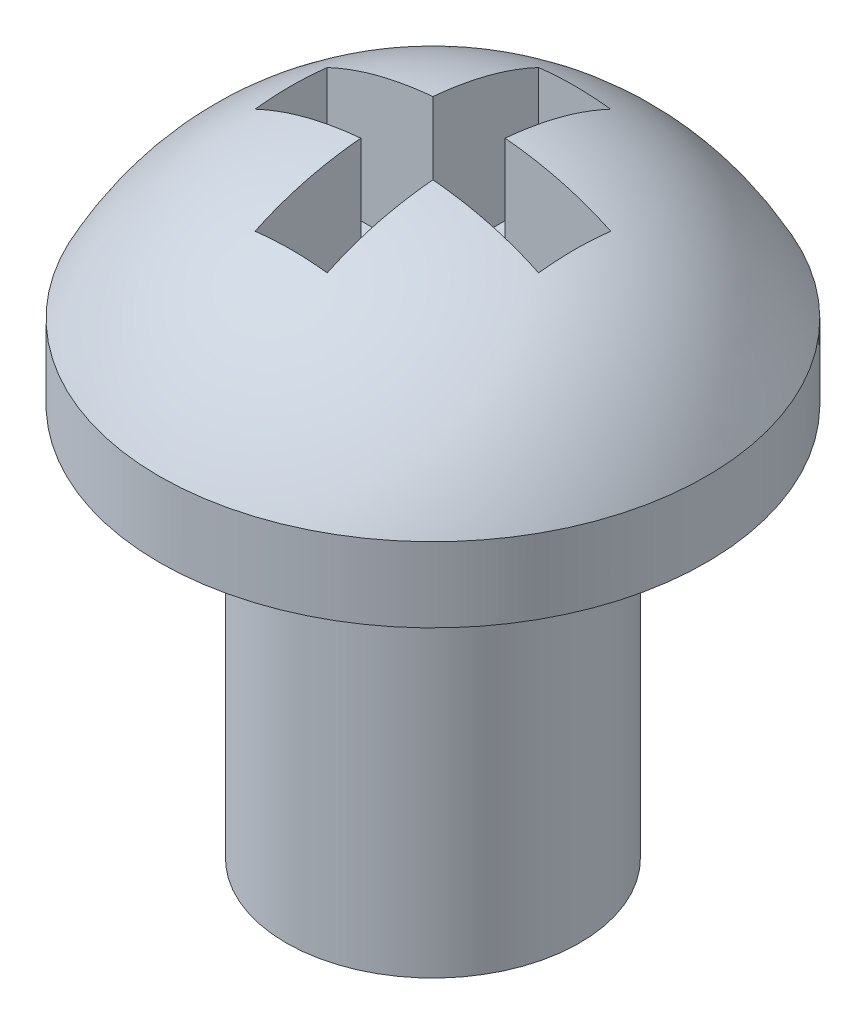
ISO-10303-21;
HEADER;
FILE_DESCRIPTION(('STEP AP214'),'2;1');
FILE_NAME('part.step','',(''),(''),'','','');
FILE_SCHEMA(('AUTOMOTIVE_DESIGN { 1 0 10303 214 1 1 1 1 }'));
ENDSEC;
DATA;
#1=APPLICATION_CONTEXT('core data for automotive mechanical design processes');
#2=APPLICATION_PROTOCOL_DEFINITION('international standard','automotive_design',2000,#1);
#3=PRODUCT_CONTEXT('',#1,'mechanical');
#4=PRODUCT('Part','Part','',(#3));
#5=PRODUCT_RELATED_PRODUCT_CATEGORY('part','',(#4));
#6=PRODUCT_DEFINITION_FORMATION('','',#4);
#7=PRODUCT_DEFINITION_CONTEXT('part definition',#1,'design');
#8=PRODUCT_DEFINITION('design','',#6,#7);
#9=PRODUCT_DEFINITION_SHAPE('','',#8);
#10=(LENGTH_UNIT() NAMED_UNIT(*) SI_UNIT(.MILLI.,.METRE.));
#11=(NAMED_UNIT(*) PLANE_ANGLE_UNIT() SI_UNIT($,.RADIAN.));
#12=(NAMED_UNIT(*) SI_UNIT($,.STERADIAN.) SOLID_ANGLE_UNIT());
#13=UNCERTAINTY_MEASURE_WITH_UNIT(LENGTH_MEASURE(1.E-05),#10,'distance_accuracy_value','');
#14=(GEOMETRIC_REPRESENTATION_CONTEXT(3) GLOBAL_UNCERTAINTY_ASSIGNED_CONTEXT((#13)) GLOBAL_UNIT_ASSIGNED_CONTEXT((#10,
#11,#12)) REPRESENTATION_CONTEXT('',''));
#15=CARTESIAN_POINT('',(0.,0.,0.));
#16=DIRECTION('',(0.,0.,1.));
#17=DIRECTION('',(1.,0.,0.));
#18=AXIS2_PLACEMENT_3D('',#15,#16,#17);
#19=CARTESIAN_POINT('',(0.,0.889,0.));
#20=DIRECTION('',(0.,1.,0.));
#21=DIRECTION('',(0.,0.,1.));
#22=AXIS2_PLACEMENT_3D('',#19,#20,#21);
#23=PLANE('',#22);
#24=DIRECTION('',(-1.,0.,0.));
#25=VECTOR('',#24,1.);
#26=CARTESIAN_POINT('',(0.3683,0.889,-1.4478));
#27=LINE('',#26,#25);
#28=CARTESIAN_POINT('',(0.3683,0.889,-1.4478));
#29=VERTEX_POINT('',#28);
#30=CARTESIAN_POINT('',(-0.3683,0.889,-1.4478));
#31=VERTEX_POINT('',#30);
#32=EDGE_CURVE('E123',#29,#31,#27,.T.);
#33=ORIENTED_EDGE('',*,*,#32,.T.);
#34=DIRECTION('',(0.,0.,1.));
#35=VECTOR('',#34,1.);
#36=CARTESIAN_POINT('',(-0.3683,0.889,-1.4478));
#37=LINE('',#36,#35);
#38=CARTESIAN_POINT('',(-0.3683,0.889,-0.3683));
#39=VERTEX_POINT('',#38);
#40=EDGE_CURVE('E92',#31,#39,#37,.T.);
#41=ORIENTED_EDGE('',*,*,#40,.T.);
#42=DIRECTION('',(-1.,0.,0.));
#43=VECTOR('',#42,1.);
#44=CARTESIAN_POINT('',(-0.3683,0.889,-0.3683));
#45=LINE('',#44,#43);
#46=CARTESIAN_POINT('',(-1.4478,0.889,-0.3683));
#47=VERTEX_POINT('',#46);
#48=EDGE_CURVE('E238',#39,#47,#45,.T.);
#49=ORIENTED_EDGE('',*,*,#48,.T.);
#50=DIRECTION('',(0.,0.,1.));
#51=VECTOR('',#50,1.);
#52=CARTESIAN_POINT('',(-1.4478,0.889,-0.3683));
#53=LINE('',#52,#51);
#54=CARTESIAN_POINT('',(-1.4478,0.889,0.3683));
#55=VERTEX_POINT('',#54);
#56=EDGE_CURVE('E146',#47,#55,#53,.T.);
#57=ORIENTED_EDGE('',*,*,#56,.T.);
#58=DIRECTION('',(1.,0.,0.));
#59=VECTOR('',#58,1.);
#60=CARTESIAN_POINT('',(-1.4478,0.889,0.3683));
#61=LINE('',#60,#59);
#62=CARTESIAN_POINT('',(-0.3683,0.889,0.3683));
#63=VERTEX_POINT('',#62);
#64=EDGE_CURVE('E152',#55,#63,#61,.T.);
#65=ORIENTED_EDGE('',*,*,#64,.T.);
#66=DIRECTION('',(0.,0.,1.));
#67=VECTOR('',#66,1.);
#68=CARTESIAN_POINT('',(-0.3683,0.889,0.3683));
#69=LINE('',#68,#67);
#70=CARTESIAN_POINT('',(-0.3683,0.889,1.4478));
#71=VERTEX_POINT('',#70);
#72=EDGE_CURVE('E157',#63,#71,#69,.T.);
#73=ORIENTED_EDGE('',*,*,#72,.T.);
#74=DIRECTION('',(1.,0.,0.));
#75=VECTOR('',#74,1.);
#76=CARTESIAN_POINT('',(-0.3683,0.889,1.4478));
#77=LINE('',#76,#75);
#78=CARTESIAN_POINT('',(0.3683,0.889,1.4478));
#79=VERTEX_POINT('',#78);
#80=EDGE_CURVE('E136',#71,#79,#77,.T.);
#81=ORIENTED_EDGE('',*,*,#80,.T.);
#82=DIRECTION('',(0.,0.,-1.));
#83=VECTOR('',#82,1.);
#84=CARTESIAN_POINT('',(0.3683,0.889,1.4478));
#85=LINE('',#84,#83);
#86=CARTESIAN_POINT('',(0.3683,0.889,0.3683));
#87=VERTEX_POINT('',#86);
#88=EDGE_CURVE('E163',#79,#87,#85,.T.);
#89=ORIENTED_EDGE('',*,*,#88,.T.);
#90=DIRECTION('',(1.,0.,0.));
#91=VECTOR('',#90,1.);
#92=CARTESIAN_POINT('',(0.3683,0.889,0.3683));
#93=LINE('',#92,#91);
#94=CARTESIAN_POINT('',(1.4478,0.889,0.3683));
#95=VERTEX_POINT('',#94);
#96=EDGE_CURVE('E170',#87,#95,#93,.T.);
#97=ORIENTED_EDGE('',*,*,#96,.T.);
#98=DIRECTION('',(0.,0.,-1.));
#99=VECTOR('',#98,1.);
#100=CARTESIAN_POINT('',(1.4478,0.889,0.3683));
#101=LINE('',#100,#99);
#102=CARTESIAN_POINT('',(1.4478,0.889,-0.3683));
#103=VERTEX_POINT('',#102);
#104=EDGE_CURVE('E175',#95,#103,#101,.T.);
#105=ORIENTED_EDGE('',*,*,#104,.T.);
#106=DIRECTION('',(-1.,0.,0.));
#107=VECTOR('',#106,1.);
#108=CARTESIAN_POINT('',(1.4478,0.889,-0.3683));
#109=LINE('',#108,#107);
#110=CARTESIAN_POINT('',(0.3683,0.889,-0.3683));
#111=VERTEX_POINT('',#110);
#112=EDGE_CURVE('E126',#103,#111,#109,.T.);
#113=ORIENTED_EDGE('',*,*,#112,.T.);
#114=DIRECTION('',(0.,0.,-1.));
#115=VECTOR('',#114,1.);
#116=CARTESIAN_POINT('',(0.3683,0.889,-0.3683));
#117=LINE('',#116,#115);
#118=EDGE_CURVE('E120',#111,#29,#117,.T.);
#119=ORIENTED_EDGE('',*,*,#118,.T.);
#120=EDGE_LOOP('',(#33,#41,#49,#57,#65,#73,#81,#89,#97,#105,#113,#119));
#121=FACE_BOUND('',#120,.T.);
#122=ADVANCED_FACE('F17',(#121),#23,.T.);
#123=CARTESIAN_POINT('',(0.3683,2.921,-0.3683));
#124=DIRECTION('',(1.,0.,0.));
#125=DIRECTION('',(0.,0.,-1.));
#126=AXIS2_PLACEMENT_3D('',#123,#124,#125);
#127=PLANE('',#126);
#128=DIRECTION('',(0.,1.,0.));
#129=VECTOR('',#128,1.);
#130=CARTESIAN_POINT('',(0.3683,2.921,-1.4478));
#131=LINE('',#130,#129);
#132=CARTESIAN_POINT('',(0.368299999999467,2.07264834657823,-1.44779999999055));
#133=VERTEX_POINT('',#132);
#134=EDGE_CURVE('E128',#133,#29,#131,.F.);
#135=ORIENTED_EDGE('',*,*,#134,.T.);
#136=ORIENTED_EDGE('',*,*,#118,.F.);
#137=DIRECTION('',(0.,1.,0.));
#138=VECTOR('',#137,1.);
#139=CARTESIAN_POINT('',(0.3683,2.921,-0.3683));
#140=LINE('',#139,#138);
#141=CARTESIAN_POINT('',(0.368300010789898,2.35562858009134,-0.3683));
#142=VERTEX_POINT('',#141);
#143=EDGE_CURVE('E76',#111,#142,#140,.T.);
#144=ORIENTED_EDGE('',*,*,#143,.T.);
#145=CARTESIAN_POINT('',(0.3683,2.0726118187436,-1.44787696444893));
#146=CARTESIAN_POINT('',(0.3683,2.09280651130751,-1.40533658499151));
#147=CARTESIAN_POINT('',(0.3683,2.11190026710847,-1.36227810781092));
#148=CARTESIAN_POINT('',(0.3683,2.14779770116496,-1.27553185377699));
#149=CARTESIAN_POINT('',(0.3683,2.16461496615479,-1.23184970317808));
#150=CARTESIAN_POINT('',(0.3683,2.1960628143741,-1.14389631537386));
#151=CARTESIAN_POINT('',(0.3683,2.2107015501155,-1.09962798601404));
#152=CARTESIAN_POINT('',(0.3683,2.2378948009813,-1.01053874093526));
#153=CARTESIAN_POINT('',(0.3683,2.25045279291184,-0.965718884239403));
#154=CARTESIAN_POINT('',(0.3683,2.27356879660532,-0.875599318412506));
#155=CARTESIAN_POINT('',(0.3683,2.28412812064981,-0.830299944900254));
#156=CARTESIAN_POINT('',(0.3683,2.30335185902914,-0.739197079137124));
#157=CARTESIAN_POINT('',(0.3683,2.31201201476126,-0.693392691017519));
#158=CARTESIAN_POINT('',(0.3683,2.32751957396641,-0.601294070177135));
#159=CARTESIAN_POINT('',(0.3683,2.33435969292916,-0.554998617981862));
#160=CARTESIAN_POINT('',(0.3683,2.34630000052672,-0.461927306969817));
#161=CARTESIAN_POINT('',(0.3683,2.35139052490193,-0.415150204746829));
#162=CARTESIAN_POINT('',(0.368300000000001,2.35562869938095,-0.368300021579796));
#163=B_SPLINE_CURVE_WITH_KNOTS('',3,(#145,#146,#147,#148,#149,#150,#151,#152,#153,#154,#155,
#156,#157,#158,#159,#160,#161,#162),.UNSPECIFIED.,.F.,.F.,(4,2,2,2,2,2,2,2,4),(0.,
0.141249649925463,0.281615139896473,0.421441378426826,0.561031566041087,0.7005297814342,
0.840337672994682,0.980696989582692,1.12181959897531),.UNSPECIFIED.);
#164=EDGE_CURVE('E20',#133,#142,#163,.T.);
#165=ORIENTED_EDGE('',*,*,#164,.F.);
#166=EDGE_LOOP('',(#135,#136,#144,#165));
#167=FACE_BOUND('',#166,.T.);
#168=ADVANCED_FACE('F129',(#167),#127,.F.);
#169=CARTESIAN_POINT('',(1.4478,2.921,-0.3683));
#170=DIRECTION('',(0.,0.,-1.));
#171=DIRECTION('',(-1.,0.,0.));
#172=AXIS2_PLACEMENT_3D('',#169,#170,#171);
#173=PLANE('',#172);
#174=ORIENTED_EDGE('',*,*,#143,.F.);
#175=ORIENTED_EDGE('',*,*,#112,.F.);
#176=DIRECTION('',(0.,1.,0.));
#177=VECTOR('',#176,1.);
#178=CARTESIAN_POINT('',(1.4478,2.921,-0.3683));
#179=LINE('',#178,#177);
#180=CARTESIAN_POINT('',(1.44779999999997,2.07264834657369,-0.368300000000003));
#181=VERTEX_POINT('',#180);
#182=EDGE_CURVE('E172',#103,#181,#179,.T.);
#183=ORIENTED_EDGE('',*,*,#182,.T.);
#184=CARTESIAN_POINT('',(0.368300021579796,2.35562869938095,-0.3683));
#185=CARTESIAN_POINT('',(0.415150204746828,2.35139052490193,-0.3683));
#186=CARTESIAN_POINT('',(0.461927306969816,2.34630000052672,-0.3683));
#187=CARTESIAN_POINT('',(0.554998617981861,2.33435969292916,-0.3683));
#188=CARTESIAN_POINT('',(0.601294070177134,2.32751957396641,-0.3683));
#189=CARTESIAN_POINT('',(0.693392691017519,2.31201201476126,-0.3683));
#190=CARTESIAN_POINT('',(0.739197079137124,2.30335185902914,-0.3683));
#191=CARTESIAN_POINT('',(0.830299944900253,2.28412812064981,-0.3683));
#192=CARTESIAN_POINT('',(0.875599318412505,2.27356879660532,-0.3683));
#193=CARTESIAN_POINT('',(0.965718884239402,2.25045279291185,-0.3683));
#194=CARTESIAN_POINT('',(1.01053874093526,2.2378948009813,-0.3683));
#195=CARTESIAN_POINT('',(1.09962798601404,2.2107015501155,-0.3683));
#196=CARTESIAN_POINT('',(1.14389631537386,2.1960628143741,-0.3683));
#197=CARTESIAN_POINT('',(1.23184970317808,2.16461496615479,-0.3683));
#198=CARTESIAN_POINT('',(1.27553185377699,2.14779770116496,-0.3683));
#199=CARTESIAN_POINT('',(1.36227810781092,2.11190026710847,-0.3683));
#200=CARTESIAN_POINT('',(1.40533658499151,2.09280651130751,-0.3683));
#201=CARTESIAN_POINT('',(1.44787696444893,2.0726118187436,-0.3683));
#202=B_SPLINE_CURVE_WITH_KNOTS('',3,(#184,#185,#186,#187,#188,#189,#190,#191,#192,#193,#194,
#195,#196,#197,#198,#199,#200,#201),.UNSPECIFIED.,.F.,.F.,(4,2,2,2,2,2,2,2,4),(0.,
0.141122609392623,0.281481925980632,0.421289817541115,0.560788032934228,0.700378220548488,
0.840204459078841,0.980569949049852,1.12181959897531),.UNSPECIFIED.);
#203=EDGE_CURVE('E361',#142,#181,#202,.T.);
#204=ORIENTED_EDGE('',*,*,#203,.F.);
#205=EDGE_LOOP('',(#174,#175,#183,#204));
#206=FACE_BOUND('',#205,.T.);
#207=ADVANCED_FACE('F366',(#206),#173,.F.);
#208=CARTESIAN_POINT('',(1.4478,2.921,0.3683));
#209=DIRECTION('',(1.,0.,0.));
#210=DIRECTION('',(0.,0.,-1.));
#211=AXIS2_PLACEMENT_3D('',#208,#209,#210);
#212=PLANE('',#211);
#213=ORIENTED_EDGE('',*,*,#182,.F.);
#214=ORIENTED_EDGE('',*,*,#104,.F.);
#215=DIRECTION('',(0.,1.,0.));
#216=VECTOR('',#215,1.);
#217=CARTESIAN_POINT('',(1.4478,2.921,0.3683));
#218=LINE('',#217,#216);
#219=CARTESIAN_POINT('',(1.44779999999052,2.07264834657824,0.36829999999947));
#220=VERTEX_POINT('',#219);
#221=EDGE_CURVE('E165',#95,#220,#218,.T.);
#222=ORIENTED_EDGE('',*,*,#221,.T.);
#223=CARTESIAN_POINT('',(1.4478,2.07264549196157,-0.368323644123604));
#224=CARTESIAN_POINT('',(1.4478,2.0775746608626,-0.327488076242911));
#225=CARTESIAN_POINT('',(1.4478,2.08167142491566,-0.286552891921881));
#226=CARTESIAN_POINT('',(1.4478,2.08820240910207,-0.20468079222152));
#227=CARTESIAN_POINT('',(1.4478,2.09064186602772,-0.163744294912723));
#228=CARTESIAN_POINT('',(1.4478,2.09388904960136,-0.0818717971872853));
#229=CARTESIAN_POINT('',(1.4478,2.09469935350827,-0.0409358985936425));
#230=CARTESIAN_POINT('',(1.4478,2.09469935350827,0.040935898593643));
#231=CARTESIAN_POINT('',(1.4478,2.09388904960136,0.0818717971872858));
#232=CARTESIAN_POINT('',(1.4478,2.09064186602772,0.163744294912724));
#233=CARTESIAN_POINT('',(1.4478,2.08820240910207,0.20468079222152));
#234=CARTESIAN_POINT('',(1.4478,2.08167142491566,0.286552891921882));
#235=CARTESIAN_POINT('',(1.4478,2.0775746608626,0.327488076242912));
#236=CARTESIAN_POINT('',(1.4478,2.07264549196157,0.368323644123605));
#237=B_SPLINE_CURVE_WITH_KNOTS('',3,(#223,#224,#225,#226,#227,#228,#229,#230,#231,#232,#233,
#234,#235,#236),.UNSPECIFIED.,.F.,.F.,(4,2,2,2,2,2,4),(0.,0.123386152354204,0.246380590370011,
0.369180302222005,0.491980014073999,0.614974452089805,0.738360604444009),.UNSPECIFIED.);
#238=EDGE_CURVE('E356',#181,#220,#237,.T.);
#239=ORIENTED_EDGE('',*,*,#238,.F.);
#240=EDGE_LOOP('',(#213,#214,#222,#239));
#241=FACE_BOUND('',#240,.T.);
#242=ADVANCED_FACE('F346',(#241),#212,.F.);
#243=CARTESIAN_POINT('',(0.3683,2.921,0.3683));
#244=DIRECTION('',(0.,0.,1.));
#245=DIRECTION('',(1.,0.,0.));
#246=AXIS2_PLACEMENT_3D('',#243,#244,#245);
#247=PLANE('',#246);
#248=ORIENTED_EDGE('',*,*,#221,.F.);
#249=ORIENTED_EDGE('',*,*,#96,.F.);
#250=DIRECTION('',(0.,1.,0.));
#251=VECTOR('',#250,1.);
#252=CARTESIAN_POINT('',(0.3683,2.921,0.3683));
#253=LINE('',#252,#251);
#254=CARTESIAN_POINT('',(0.3683,2.35562858009134,0.368300010789898));
#255=VERTEX_POINT('',#254);
#256=EDGE_CURVE('E131',#87,#255,#253,.T.);
#257=ORIENTED_EDGE('',*,*,#256,.T.);
#258=CARTESIAN_POINT('',(1.44787696444893,2.0726118187436,0.3683));
#259=CARTESIAN_POINT('',(1.40533658499151,2.09280651130751,0.3683));
#260=CARTESIAN_POINT('',(1.36227810781092,2.11190026710847,0.3683));
#261=CARTESIAN_POINT('',(1.27553185377699,2.14779770116496,0.3683));
#262=CARTESIAN_POINT('',(1.23184970317808,2.16461496615479,0.3683));
#263=CARTESIAN_POINT('',(1.14389631537386,2.1960628143741,0.3683));
#264=CARTESIAN_POINT('',(1.09962798601404,2.2107015501155,0.3683));
#265=CARTESIAN_POINT('',(1.01053874093526,2.2378948009813,0.3683));
#266=CARTESIAN_POINT('',(0.965718884239402,2.25045279291185,0.3683));
#267=CARTESIAN_POINT('',(0.875599318412506,2.27356879660532,0.3683));
#268=CARTESIAN_POINT('',(0.830299944900254,2.28412812064981,0.3683));
#269=CARTESIAN_POINT('',(0.739197079137124,2.30335185902914,0.3683));
#270=CARTESIAN_POINT('',(0.693392691017519,2.31201201476126,0.3683));
#271=CARTESIAN_POINT('',(0.601294070177134,2.32751957396641,0.3683));
#272=CARTESIAN_POINT('',(0.554998617981862,2.33435969292916,0.3683));
#273=CARTESIAN_POINT('',(0.461927306969817,2.34630000052672,0.3683));
#274=CARTESIAN_POINT('',(0.415150204746829,2.35139052490193,0.3683));
#275=CARTESIAN_POINT('',(0.368300021579796,2.35562869938095,0.3683));
#276=B_SPLINE_CURVE_WITH_KNOTS('',3,(#258,#259,#260,#261,#262,#263,#264,#265,#266,#267,#268,
#269,#270,#271,#272,#273,#274,#275),.UNSPECIFIED.,.F.,.F.,(4,2,2,2,2,2,2,2,4),(0.,
0.141249649925463,0.281615139896474,0.421441378426826,0.561031566041087,0.700529781434199,
0.840337672994682,0.980696989582692,1.12181959897531),.UNSPECIFIED.);
#277=EDGE_CURVE('E350',#220,#255,#276,.T.);
#278=ORIENTED_EDGE('',*,*,#277,.F.);
#279=EDGE_LOOP('',(#248,#249,#257,#278));
#280=FACE_BOUND('',#279,.T.);
#281=ADVANCED_FACE('F341',(#280),#247,.F.);
#282=CARTESIAN_POINT('',(0.3683,2.921,1.4478));
#283=DIRECTION('',(1.,0.,0.));
#284=DIRECTION('',(0.,0.,-1.));
#285=AXIS2_PLACEMENT_3D('',#282,#283,#284);
#286=PLANE('',#285);
#287=ORIENTED_EDGE('',*,*,#256,.F.);
#288=ORIENTED_EDGE('',*,*,#88,.F.);
#289=DIRECTION('',(0.,1.,0.));
#290=VECTOR('',#289,1.);
#291=CARTESIAN_POINT('',(0.3683,2.921,1.4478));
#292=LINE('',#291,#290);
#293=CARTESIAN_POINT('',(0.3683,2.07264834657368,1.4478));
#294=VERTEX_POINT('',#293);
#295=EDGE_CURVE('E138',#79,#294,#292,.T.);
#296=ORIENTED_EDGE('',*,*,#295,.T.);
#297=CARTESIAN_POINT('',(0.3683,2.35562869938095,0.368300021579796));
#298=CARTESIAN_POINT('',(0.3683,2.35139052490193,0.415150204746829));
#299=CARTESIAN_POINT('',(0.3683,2.34630000052672,0.461927306969817));
#300=CARTESIAN_POINT('',(0.3683,2.33435969292916,0.554998617981862));
#301=CARTESIAN_POINT('',(0.3683,2.32751957396641,0.601294070177134));
#302=CARTESIAN_POINT('',(0.3683,2.31201201476126,0.693392691017519));
#303=CARTESIAN_POINT('',(0.3683,2.30335185902914,0.739197079137124));
#304=CARTESIAN_POINT('',(0.3683,2.28412812064981,0.830299944900254));
#305=CARTESIAN_POINT('',(0.3683,2.27356879660532,0.875599318412506));
#306=CARTESIAN_POINT('',(0.3683,2.25045279291185,0.965718884239402));
#307=CARTESIAN_POINT('',(0.3683,2.2378948009813,1.01053874093526));
#308=CARTESIAN_POINT('',(0.3683,2.2107015501155,1.09962798601404));
#309=CARTESIAN_POINT('',(0.3683,2.1960628143741,1.14389631537386));
#310=CARTESIAN_POINT('',(0.3683,2.16461496615479,1.23184970317808));
#311=CARTESIAN_POINT('',(0.3683,2.14779770116496,1.27553185377699));
#312=CARTESIAN_POINT('',(0.3683,2.11190026710847,1.36227810781092));
#313=CARTESIAN_POINT('',(0.3683,2.09280651130751,1.40533658499151));
#314=CARTESIAN_POINT('',(0.368300000000001,2.0726118187436,1.44787696444893));
#315=B_SPLINE_CURVE_WITH_KNOTS('',3,(#297,#298,#299,#300,#301,#302,#303,#304,#305,#306,#307,
#308,#309,#310,#311,#312,#313,#314),.UNSPECIFIED.,.F.,.F.,(4,2,2,2,2,2,2,2,4),(0.,
0.141122609392623,0.281481925980632,0.421289817541115,0.560788032934228,0.700378220548488,
0.840204459078842,0.980569949049852,1.12181959897532),.UNSPECIFIED.);
#316=EDGE_CURVE('E324',#255,#294,#315,.T.);
#317=ORIENTED_EDGE('',*,*,#316,.F.);
#318=EDGE_LOOP('',(#287,#288,#296,#317));
#319=FACE_BOUND('',#318,.T.);
#320=ADVANCED_FACE('F337',(#319),#286,.F.);
#321=CARTESIAN_POINT('',(0.3683,2.921,-1.4478));
#322=DIRECTION('',(0.,0.,-1.));
#323=DIRECTION('',(-1.,0.,0.));
#324=AXIS2_PLACEMENT_3D('',#321,#322,#323);
#325=PLANE('',#324);
#326=ORIENTED_EDGE('',*,*,#134,.F.);
#327=CARTESIAN_POINT('',(-0.368323644123605,2.07264549196157,-1.4478));
#328=CARTESIAN_POINT('',(-0.307121453353231,2.08002881533036,-1.44780000000001));
#329=CARTESIAN_POINT('',(-0.245697893156724,2.08554880056336,-1.4478));
#330=CARTESIAN_POINT('',(-0.122849031384663,2.09287749342602,-1.4478));
#331=CARTESIAN_POINT('',(-0.0614245156923278,2.09469935349707,-1.44779999999999));
#332=CARTESIAN_POINT('',(0.0614245156923404,2.09469935349707,-1.44779999999999));
#333=CARTESIAN_POINT('',(0.122849031384673,2.09287749342602,-1.4478));
#334=CARTESIAN_POINT('',(0.245697893156728,2.08554880056336,-1.4478));
#335=CARTESIAN_POINT('',(0.307121453353233,2.08002881533035,-1.44780000000001));
#336=CARTESIAN_POINT('',(0.368323644123604,2.07264549196157,-1.4478));
#337=B_SPLINE_CURVE_WITH_KNOTS('',3,(#327,#328,#329,#330,#331,#332,#333,#334,#335,#336),
.UNSPECIFIED.,.F.,.F.,(4,2,2,2,4),(0.,0.184904124471589,0.36914947405277,0.553394823633942,
0.738298948105523),.UNSPECIFIED.);
#338=CARTESIAN_POINT('',(-0.3683,2.07264834657368,-1.4478));
#339=VERTEX_POINT('',#338);
#340=EDGE_CURVE('E83',#339,#133,#337,.T.);
#341=ORIENTED_EDGE('',*,*,#340,.F.);
#342=DIRECTION('',(0.,1.,0.));
#343=VECTOR('',#342,1.);
#344=CARTESIAN_POINT('',(-0.3683,2.921,-1.4478));
#345=LINE('',#344,#343);
#346=EDGE_CURVE('E135',#339,#31,#345,.F.);
#347=ORIENTED_EDGE('',*,*,#346,.T.);
#348=ORIENTED_EDGE('',*,*,#32,.F.);
#349=EDGE_LOOP('',(#326,#341,#347,#348));
#350=FACE_BOUND('',#349,.T.);
#351=ADVANCED_FACE('F133',(#350),#325,.F.);
#352=CARTESIAN_POINT('',(-0.3683,2.921,1.4478));
#353=DIRECTION('',(0.,0.,1.));
#354=DIRECTION('',(1.,0.,0.));
#355=AXIS2_PLACEMENT_3D('',#352,#353,#354);
#356=PLANE('',#355);
#357=CARTESIAN_POINT('',(0.368323644123604,2.07264549196157,1.4478));
#358=CARTESIAN_POINT('',(0.307121453353232,2.08002881533036,1.4478));
#359=CARTESIAN_POINT('',(0.245697893156726,2.08554880056336,1.4478));
#360=CARTESIAN_POINT('',(0.122849031384668,2.09287749342602,1.4478));
#361=CARTESIAN_POINT('',(0.0614245156923342,2.09469935349707,1.4478));
#362=CARTESIAN_POINT('',(-0.0614245156923338,2.09469935349707,1.4478));
#363=CARTESIAN_POINT('',(-0.122849031384668,2.09287749342602,1.4478));
#364=CARTESIAN_POINT('',(-0.245697893156725,2.08554880056336,1.4478));
#365=CARTESIAN_POINT('',(-0.307121453353231,2.08002881533036,1.4478));
#366=CARTESIAN_POINT('',(-0.368323644123603,2.07264549196157,1.4478));
#367=B_SPLINE_CURVE_WITH_KNOTS('',3,(#357,#358,#359,#360,#361,#362,#363,#364,#365,#366),
.UNSPECIFIED.,.F.,.F.,(4,2,2,2,4),(0.,0.184904124471585,0.369149474052761,0.553394823633937,
0.738298948105522),.UNSPECIFIED.);
#368=CARTESIAN_POINT('',(-0.368299999999466,2.07264834657823,1.44779999999054));
#369=VERTEX_POINT('',#368);
#370=EDGE_CURVE('E316',#294,#369,#367,.T.);
#371=ORIENTED_EDGE('',*,*,#370,.F.);
#372=ORIENTED_EDGE('',*,*,#295,.F.);
#373=ORIENTED_EDGE('',*,*,#80,.F.);
#374=DIRECTION('',(0.,1.,0.));
#375=VECTOR('',#374,1.);
#376=CARTESIAN_POINT('',(-0.3683,2.921,1.4478));
#377=LINE('',#376,#375);
#378=EDGE_CURVE('E154',#71,#369,#377,.T.);
#379=ORIENTED_EDGE('',*,*,#378,.T.);
#380=EDGE_LOOP('',(#371,#372,#373,#379));
#381=FACE_BOUND('',#380,.T.);
#382=ADVANCED_FACE('F308',(#381),#356,.F.);
#383=CARTESIAN_POINT('',(-0.3683,2.921,0.3683));
#384=DIRECTION('',(-1.,0.,0.));
#385=DIRECTION('',(0.,0.,1.));
#386=AXIS2_PLACEMENT_3D('',#383,#384,#385);
#387=PLANE('',#386);
#388=ORIENTED_EDGE('',*,*,#378,.F.);
#389=ORIENTED_EDGE('',*,*,#72,.F.);
#390=DIRECTION('',(0.,1.,0.));
#391=VECTOR('',#390,1.);
#392=CARTESIAN_POINT('',(-0.3683,2.921,0.3683));
#393=LINE('',#392,#391);
#394=CARTESIAN_POINT('',(-0.368300010789898,2.35562858009134,0.3683));
#395=VERTEX_POINT('',#394);
#396=EDGE_CURVE('E149',#63,#395,#393,.T.);
#397=ORIENTED_EDGE('',*,*,#396,.T.);
#398=CARTESIAN_POINT('',(-0.3683,2.0726118187436,1.44787696444893));
#399=CARTESIAN_POINT('',(-0.3683,2.09280651130751,1.40533658499151));
#400=CARTESIAN_POINT('',(-0.3683,2.11190026710847,1.36227810781092));
#401=CARTESIAN_POINT('',(-0.3683,2.14779770116496,1.27553185377699));
#402=CARTESIAN_POINT('',(-0.3683,2.16461496615479,1.23184970317808));
#403=CARTESIAN_POINT('',(-0.3683,2.1960628143741,1.14389631537386));
#404=CARTESIAN_POINT('',(-0.3683,2.2107015501155,1.09962798601404));
#405=CARTESIAN_POINT('',(-0.3683,2.2378948009813,1.01053874093526));
#406=CARTESIAN_POINT('',(-0.3683,2.25045279291185,0.965718884239402));
#407=CARTESIAN_POINT('',(-0.3683,2.27356879660532,0.875599318412506));
#408=CARTESIAN_POINT('',(-0.3683,2.28412812064981,0.830299944900254));
#409=CARTESIAN_POINT('',(-0.3683,2.30335185902914,0.739197079137124));
#410=CARTESIAN_POINT('',(-0.3683,2.31201201476126,0.693392691017519));
#411=CARTESIAN_POINT('',(-0.3683,2.32751957396641,0.601294070177135));
#412=CARTESIAN_POINT('',(-0.3683,2.33435969292916,0.554998617981862));
#413=CARTESIAN_POINT('',(-0.3683,2.34630000052672,0.461927306969817));
#414=CARTESIAN_POINT('',(-0.3683,2.35139052490193,0.415150204746829));
#415=CARTESIAN_POINT('',(-0.3683,2.35562869938095,0.368300021579796));
#416=B_SPLINE_CURVE_WITH_KNOTS('',3,(#398,#399,#400,#401,#402,#403,#404,#405,#406,#407,#408,
#409,#410,#411,#412,#413,#414,#415),.UNSPECIFIED.,.F.,.F.,(4,2,2,2,2,2,2,2,4),(0.,
0.141249649925463,0.281615139896474,0.421441378426826,0.561031566041087,0.700529781434199,
0.840337672994682,0.980696989582692,1.12181959897531),.UNSPECIFIED.);
#417=EDGE_CURVE('E285',#369,#395,#416,.T.);
#418=ORIENTED_EDGE('',*,*,#417,.F.);
#419=EDGE_LOOP('',(#388,#389,#397,#418));
#420=FACE_BOUND('',#419,.T.);
#421=ADVANCED_FACE('F303',(#420),#387,.F.);
#422=CARTESIAN_POINT('',(-1.4478,2.921,0.3683));
#423=DIRECTION('',(0.,0.,1.));
#424=DIRECTION('',(1.,0.,0.));
#425=AXIS2_PLACEMENT_3D('',#422,#423,#424);
#426=PLANE('',#425);
#427=ORIENTED_EDGE('',*,*,#396,.F.);
#428=ORIENTED_EDGE('',*,*,#64,.F.);
#429=DIRECTION('',(0.,1.,0.));
#430=VECTOR('',#429,1.);
#431=CARTESIAN_POINT('',(-1.4478,2.921,0.3683));
#432=LINE('',#431,#430);
#433=CARTESIAN_POINT('',(-1.44779999999997,2.07264834657369,0.368300000000002));
#434=VERTEX_POINT('',#433);
#435=EDGE_CURVE('E148',#55,#434,#432,.T.);
#436=ORIENTED_EDGE('',*,*,#435,.T.);
#437=CARTESIAN_POINT('',(-0.368300021579795,2.35562869938095,0.3683));
#438=CARTESIAN_POINT('',(-0.415150204746828,2.35139052490193,0.3683));
#439=CARTESIAN_POINT('',(-0.461927306969816,2.34630000052672,0.3683));
#440=CARTESIAN_POINT('',(-0.554998617981861,2.33435969292916,0.3683));
#441=CARTESIAN_POINT('',(-0.601294070177134,2.32751957396641,0.3683));
#442=CARTESIAN_POINT('',(-0.693392691017519,2.31201201476126,0.3683));
#443=CARTESIAN_POINT('',(-0.739197079137124,2.30335185902914,0.3683));
#444=CARTESIAN_POINT('',(-0.830299944900253,2.28412812064981,0.3683));
#445=CARTESIAN_POINT('',(-0.875599318412506,2.27356879660532,0.3683));
#446=CARTESIAN_POINT('',(-0.965718884239402,2.25045279291185,0.3683));
#447=CARTESIAN_POINT('',(-1.01053874093526,2.2378948009813,0.3683));
#448=CARTESIAN_POINT('',(-1.09962798601404,2.2107015501155,0.3683));
#449=CARTESIAN_POINT('',(-1.14389631537386,2.1960628143741,0.3683));
#450=CARTESIAN_POINT('',(-1.23184970317808,2.16461496615479,0.3683));
#451=CARTESIAN_POINT('',(-1.27553185377699,2.14779770116496,0.3683));
#452=CARTESIAN_POINT('',(-1.36227810781092,2.11190026710847,0.3683));
#453=CARTESIAN_POINT('',(-1.40533658499151,2.09280651130751,0.3683));
#454=CARTESIAN_POINT('',(-1.44787696444893,2.0726118187436,0.3683));
#455=B_SPLINE_CURVE_WITH_KNOTS('',3,(#437,#438,#439,#440,#441,#442,#443,#444,#445,#446,#447,
#448,#449,#450,#451,#452,#453,#454),.UNSPECIFIED.,.F.,.F.,(4,2,2,2,2,2,2,2,4),(0.,
0.141122609392623,0.281481925980632,0.421289817541115,0.560788032934228,0.700378220548488,
0.840204459078841,0.980569949049852,1.12181959897531),.UNSPECIFIED.);
#456=EDGE_CURVE('E284',#395,#434,#455,.T.);
#457=ORIENTED_EDGE('',*,*,#456,.F.);
#458=EDGE_LOOP('',(#427,#428,#436,#457));
#459=FACE_BOUND('',#458,.T.);
#460=ADVANCED_FACE('F298',(#459),#426,.F.);
#461=CARTESIAN_POINT('',(-1.4478,2.921,-0.3683));
#462=DIRECTION('',(-1.,0.,0.));
#463=DIRECTION('',(0.,0.,1.));
#464=AXIS2_PLACEMENT_3D('',#461,#462,#463);
#465=PLANE('',#464);
#466=ORIENTED_EDGE('',*,*,#435,.F.);
#467=ORIENTED_EDGE('',*,*,#56,.F.);
#468=DIRECTION('',(0.,1.,0.));
#469=VECTOR('',#468,1.);
#470=CARTESIAN_POINT('',(-1.4478,2.921,-0.3683));
#471=LINE('',#470,#469);
#472=CARTESIAN_POINT('',(-1.44779999999052,2.07264834657824,-0.368299999999472));
#473=VERTEX_POINT('',#472);
#474=EDGE_CURVE('E234',#47,#473,#471,.T.);
#475=ORIENTED_EDGE('',*,*,#474,.T.);
#476=CARTESIAN_POINT('',(-1.4478,2.07264549196157,0.368323644123605));
#477=CARTESIAN_POINT('',(-1.4478,2.0775746608626,0.327488076242912));
#478=CARTESIAN_POINT('',(-1.4478,2.08167142491566,0.286552891921882));
#479=CARTESIAN_POINT('',(-1.4478,2.08820240910207,0.204680792221521));
#480=CARTESIAN_POINT('',(-1.4478,2.09064186602772,0.163744294912724));
#481=CARTESIAN_POINT('',(-1.4478,2.09388904960136,0.0818717971872859));
#482=CARTESIAN_POINT('',(-1.4478,2.09469935350827,0.0409358985936431));
#483=CARTESIAN_POINT('',(-1.4478,2.09469935350827,-0.0409358985936426));
#484=CARTESIAN_POINT('',(-1.4478,2.09388904960136,-0.0818717971872855));
#485=CARTESIAN_POINT('',(-1.4478,2.09064186602772,-0.163744294912724));
#486=CARTESIAN_POINT('',(-1.4478,2.08820240910208,-0.20468079222152));
#487=CARTESIAN_POINT('',(-1.4478,2.08167142491566,-0.286552891921882));
#488=CARTESIAN_POINT('',(-1.4478,2.0775746608626,-0.327488076242912));
#489=CARTESIAN_POINT('',(-1.4478,2.07264549196157,-0.368323644123605));
#490=B_SPLINE_CURVE_WITH_KNOTS('',3,(#476,#477,#478,#479,#480,#481,#482,#483,#484,#485,#486,
#487,#488,#489),.UNSPECIFIED.,.F.,.F.,(4,2,2,2,2,2,4),(0.,0.123386152354204,0.246380590370011,
0.369180302222005,0.491980014073999,0.614974452089806,0.73836060444401),.UNSPECIFIED.);
#491=EDGE_CURVE('E280',#434,#473,#490,.T.);
#492=ORIENTED_EDGE('',*,*,#491,.F.);
#493=EDGE_LOOP('',(#466,#467,#475,#492));
#494=FACE_BOUND('',#493,.T.);
#495=ADVANCED_FACE('F275',(#494),#465,.F.);
#496=CARTESIAN_POINT('',(-0.3683,2.921,-0.3683));
#497=DIRECTION('',(0.,0.,-1.));
#498=DIRECTION('',(-1.,0.,0.));
#499=AXIS2_PLACEMENT_3D('',#496,#497,#498);
#500=PLANE('',#499);
#501=ORIENTED_EDGE('',*,*,#474,.F.);
#502=ORIENTED_EDGE('',*,*,#48,.F.);
#503=DIRECTION('',(0.,1.,0.));
#504=VECTOR('',#503,1.);
#505=CARTESIAN_POINT('',(-0.3683,2.921,-0.3683));
#506=LINE('',#505,#504);
#507=CARTESIAN_POINT('',(-0.3683,2.35562858009134,-0.368300010789898));
#508=VERTEX_POINT('',#507);
#509=EDGE_CURVE('E39',#39,#508,#506,.T.);
#510=ORIENTED_EDGE('',*,*,#509,.T.);
#511=CARTESIAN_POINT('',(-1.44787696444893,2.0726118187436,-0.368299999999999));
#512=CARTESIAN_POINT('',(-1.40533658499151,2.09280651130751,-0.3683));
#513=CARTESIAN_POINT('',(-1.36227810781092,2.11190026710847,-0.3683));
#514=CARTESIAN_POINT('',(-1.27553185377699,2.14779770116496,-0.3683));
#515=CARTESIAN_POINT('',(-1.23184970317808,2.16461496615479,-0.3683));
#516=CARTESIAN_POINT('',(-1.14389631537386,2.1960628143741,-0.3683));
#517=CARTESIAN_POINT('',(-1.09962798601404,2.2107015501155,-0.3683));
#518=CARTESIAN_POINT('',(-1.01053874093526,2.2378948009813,-0.3683));
#519=CARTESIAN_POINT('',(-0.965718884239402,2.25045279291185,-0.3683));
#520=CARTESIAN_POINT('',(-0.875599318412506,2.27356879660532,-0.3683));
#521=CARTESIAN_POINT('',(-0.830299944900254,2.28412812064981,-0.3683));
#522=CARTESIAN_POINT('',(-0.739197079137124,2.30335185902914,-0.3683));
#523=CARTESIAN_POINT('',(-0.693392691017519,2.31201201476126,-0.3683));
#524=CARTESIAN_POINT('',(-0.601294070177134,2.32751957396641,-0.3683));
#525=CARTESIAN_POINT('',(-0.554998617981862,2.33435969292916,-0.3683));
#526=CARTESIAN_POINT('',(-0.461927306969817,2.34630000052672,-0.3683));
#527=CARTESIAN_POINT('',(-0.415150204746829,2.35139052490193,-0.3683));
#528=CARTESIAN_POINT('',(-0.368300021579796,2.35562869938095,-0.3683));
#529=B_SPLINE_CURVE_WITH_KNOTS('',3,(#511,#512,#513,#514,#515,#516,#517,#518,#519,#520,#521,
#522,#523,#524,#525,#526,#527,#528),.UNSPECIFIED.,.F.,.F.,(4,2,2,2,2,2,2,2,4),(0.,
0.141249649925463,0.281615139896473,0.421441378426826,0.561031566041086,0.700529781434199,
0.840337672994682,0.980696989582692,1.12181959897531),.UNSPECIFIED.);
#530=EDGE_CURVE('E195',#473,#508,#529,.T.);
#531=ORIENTED_EDGE('',*,*,#530,.F.);
#532=EDGE_LOOP('',(#501,#502,#510,#531));
#533=FACE_BOUND('',#532,.T.);
#534=ADVANCED_FACE('F277',(#533),#500,.F.);
#535=CARTESIAN_POINT('',(-0.3683,2.921,-1.4478));
#536=DIRECTION('',(-1.,0.,0.));
#537=DIRECTION('',(0.,0.,1.));
#538=AXIS2_PLACEMENT_3D('',#535,#536,#537);
#539=PLANE('',#538);
#540=ORIENTED_EDGE('',*,*,#509,.F.);
#541=ORIENTED_EDGE('',*,*,#40,.F.);
#542=ORIENTED_EDGE('',*,*,#346,.F.);
#543=CARTESIAN_POINT('',(-0.3683,2.35562869938095,-0.368300021579796));
#544=CARTESIAN_POINT('',(-0.3683,2.35139052490193,-0.415150204746828));
#545=CARTESIAN_POINT('',(-0.3683,2.34630000052672,-0.461927306969816));
#546=CARTESIAN_POINT('',(-0.3683,2.33435969292916,-0.554998617981861));
#547=CARTESIAN_POINT('',(-0.3683,2.32751957396641,-0.601294070177134));
#548=CARTESIAN_POINT('',(-0.3683,2.31201201476126,-0.693392691017519));
#549=CARTESIAN_POINT('',(-0.3683,2.30335185902914,-0.739197079137124));
#550=CARTESIAN_POINT('',(-0.3683,2.28412812064981,-0.830299944900253));
#551=CARTESIAN_POINT('',(-0.3683,2.27356879660532,-0.875599318412506));
#552=CARTESIAN_POINT('',(-0.3683,2.25045279291185,-0.965718884239402));
#553=CARTESIAN_POINT('',(-0.3683,2.2378948009813,-1.01053874093526));
#554=CARTESIAN_POINT('',(-0.3683,2.2107015501155,-1.09962798601404));
#555=CARTESIAN_POINT('',(-0.3683,2.1960628143741,-1.14389631537386));
#556=CARTESIAN_POINT('',(-0.3683,2.16461496615479,-1.23184970317808));
#557=CARTESIAN_POINT('',(-0.3683,2.14779770116496,-1.27553185377699));
#558=CARTESIAN_POINT('',(-0.3683,2.11190026710847,-1.36227810781092));
#559=CARTESIAN_POINT('',(-0.3683,2.09280651130751,-1.40533658499151));
#560=CARTESIAN_POINT('',(-0.3683,2.0726118187436,-1.44787696444893));
#561=B_SPLINE_CURVE_WITH_KNOTS('',3,(#543,#544,#545,#546,#547,#548,#549,#550,#551,#552,#553,
#554,#555,#556,#557,#558,#559,#560),.UNSPECIFIED.,.F.,.F.,(4,2,2,2,2,2,2,2,4),(0.,
0.141122609392623,0.281481925980632,0.421289817541115,0.560788032934228,0.700378220548488,
0.840204459078841,0.980569949049852,1.12181959897531),.UNSPECIFIED.);
#562=EDGE_CURVE('E188',#508,#339,#561,.T.);
#563=ORIENTED_EDGE('',*,*,#562,.F.);
#564=EDGE_LOOP('',(#540,#541,#542,#563));
#565=FACE_BOUND('',#564,.T.);
#566=ADVANCED_FACE('F201',(#565),#539,.F.);
#567=CARTESIAN_POINT('',(0.,0.736086286694434,-2.8076188555791));
#568=CARTESIAN_POINT('',(0.,1.71319925198987,-2.29865617142929));
#569=CARTESIAN_POINT('',(0.,2.23587365856149,-1.51628594859222));
#570=CARTESIAN_POINT('',(0.,2.35901943622017,-0.49354409141886));
#571=(BOUNDED_CURVE() B_SPLINE_CURVE(3,(#567,#568,#569,#570),.UNSPECIFIED.,.F.,
.F.) B_SPLINE_CURVE_WITH_KNOTS((4,4),(0.,1.),
.UNSPECIFIED.) CURVE() GEOMETRIC_REPRESENTATION_ITEM() RATIONAL_B_SPLINE_CURVE((1.,1.,1.,1.)) REPRESENTATION_ITEM(''));
#572=CARTESIAN_POINT('',(0.,-9.8503388470731,0.));
#573=DIRECTION('',(0.,-1.,0.));
#574=AXIS1_PLACEMENT('',#572,#573);
#575=SURFACE_OF_REVOLUTION('',#571,#574);
#576=CARTESIAN_POINT('',(0.,0.762000000000001,0.));
#577=DIRECTION('',(0.,1.,0.));
#578=DIRECTION('',(0.,0.,1.));
#579=AXIS2_PLACEMENT_3D('',#576,#577,#578);
#580=CIRCLE('',#579,2.794);
#581=CARTESIAN_POINT('',(0.,0.762000000000001,2.794));
#582=VERTEX_POINT('',#581);
#583=EDGE_CURVE('E187',#582,#582,#580,.F.);
#584=ORIENTED_EDGE('',*,*,#583,.F.);
#585=EDGE_LOOP('',(#584));
#586=FACE_BOUND('',#585,.T.);
#587=ORIENTED_EDGE('',*,*,#530,.T.);
#588=ORIENTED_EDGE('',*,*,#562,.T.);
#589=ORIENTED_EDGE('',*,*,#340,.T.);
#590=ORIENTED_EDGE('',*,*,#164,.T.);
#591=ORIENTED_EDGE('',*,*,#203,.T.);
#592=ORIENTED_EDGE('',*,*,#238,.T.);
#593=ORIENTED_EDGE('',*,*,#277,.T.);
#594=ORIENTED_EDGE('',*,*,#316,.T.);
#595=ORIENTED_EDGE('',*,*,#370,.T.);
#596=ORIENTED_EDGE('',*,*,#417,.T.);
#597=ORIENTED_EDGE('',*,*,#456,.T.);
#598=ORIENTED_EDGE('',*,*,#491,.T.);
#599=EDGE_LOOP('',(#587,#588,#589,#590,#591,#592,#593,#594,#595,#596,#597,#598));
#600=FACE_BOUND('',#599,.T.);
#601=ADVANCED_FACE('F203',(#586,#600),#575,.F.);
#602=CARTESIAN_POINT('',(0.,-9.8503388470731,0.));
#603=DIRECTION('',(0.,1.,0.));
#604=DIRECTION('',(0.,0.,1.));
#605=AXIS2_PLACEMENT_3D('',#602,#603,#604);
#606=CYLINDRICAL_SURFACE('',#605,2.794);
#607=ORIENTED_EDGE('',*,*,#583,.T.);
#608=EDGE_LOOP('',(#607));
#609=FACE_BOUND('',#608,.T.);
#610=CARTESIAN_POINT('',(0.,0.,0.));
#611=DIRECTION('',(0.,1.,0.));
#612=DIRECTION('',(0.,0.,1.));
#613=AXIS2_PLACEMENT_3D('',#610,#611,#612);
#614=CIRCLE('',#613,2.794);
#615=CARTESIAN_POINT('',(0.,0.,2.794));
#616=VERTEX_POINT('',#615);
#617=EDGE_CURVE('E184',#616,#616,#614,.T.);
#618=ORIENTED_EDGE('',*,*,#617,.T.);
#619=EDGE_LOOP('',(#618));
#620=FACE_BOUND('',#619,.T.);
#621=ADVANCED_FACE('F208',(#609,#620),#606,.T.);
#622=CARTESIAN_POINT('',(0.,-4.0132,0.));
#623=DIRECTION('',(0.,1.,0.));
#624=DIRECTION('',(0.,0.,1.));
#625=AXIS2_PLACEMENT_3D('',#622,#623,#624);
#626=PLANE('',#625);
#627=CARTESIAN_POINT('',(0.,-4.0132,0.));
#628=DIRECTION('',(0.,1.,0.));
#629=DIRECTION('',(0.,0.,1.));
#630=AXIS2_PLACEMENT_3D('',#627,#628,#629);
#631=CIRCLE('',#630,1.4986);
#632=CARTESIAN_POINT('',(0.,-4.0132,1.4986));
#633=VERTEX_POINT('',#632);
#634=EDGE_CURVE('E30',#633,#633,#631,.T.);
#635=ORIENTED_EDGE('',*,*,#634,.F.);
#636=EDGE_LOOP('',(#635));
#637=FACE_BOUND('',#636,.T.);
#638=ADVANCED_FACE('F384',(#637),#626,.F.);
#639=CARTESIAN_POINT('',(0.,0.,0.));
#640=DIRECTION('',(0.,1.,0.));
#641=DIRECTION('',(0.,0.,1.));
#642=AXIS2_PLACEMENT_3D('',#639,#640,#641);
#643=PLANE('',#642);
#644=CARTESIAN_POINT('',(0.,0.,0.));
#645=DIRECTION('',(0.,1.,0.));
#646=DIRECTION('',(0.,0.,1.));
#647=AXIS2_PLACEMENT_3D('',#644,#645,#646);
#648=CIRCLE('',#647,1.4986);
#649=CARTESIAN_POINT('',(0.,0.,1.4986));
#650=VERTEX_POINT('',#649);
#651=EDGE_CURVE('E11',#650,#650,#648,.F.);
#652=ORIENTED_EDGE('',*,*,#651,.F.);
#653=EDGE_LOOP('',(#652));
#654=FACE_BOUND('',#653,.T.);
#655=ORIENTED_EDGE('',*,*,#617,.F.);
#656=EDGE_LOOP('',(#655));
#657=FACE_BOUND('',#656,.T.);
#658=ADVANCED_FACE('F378',(#654,#657),#643,.F.);
#659=CARTESIAN_POINT('',(0.,0.,0.));
#660=DIRECTION('',(0.,1.,0.));
#661=DIRECTION('',(0.,0.,1.));
#662=AXIS2_PLACEMENT_3D('',#659,#660,#661);
#663=CYLINDRICAL_SURFACE('',#662,1.4986);
#664=ORIENTED_EDGE('',*,*,#634,.T.);
#665=EDGE_LOOP('',(#664));
#666=FACE_BOUND('',#665,.T.);
#667=ORIENTED_EDGE('',*,*,#651,.T.);
#668=EDGE_LOOP('',(#667));
#669=FACE_BOUND('',#668,.T.);
#670=ADVANCED_FACE('F376',(#666,#669),#663,.T.);
#671=CLOSED_SHELL('',(#122,#168,#207,#242,#281,#320,#351,#382,#421,#460,#495,#534,#566,#601,
#621,#638,#658,#670));
#672=MANIFOLD_SOLID_BREP('B1',#671);
#673=ADVANCED_BREP_SHAPE_REPRESENTATION('',(#18,#672),#14);
#674=SHAPE_DEFINITION_REPRESENTATION(#9,#673);
ENDSEC;
END-ISO-10303-21;
